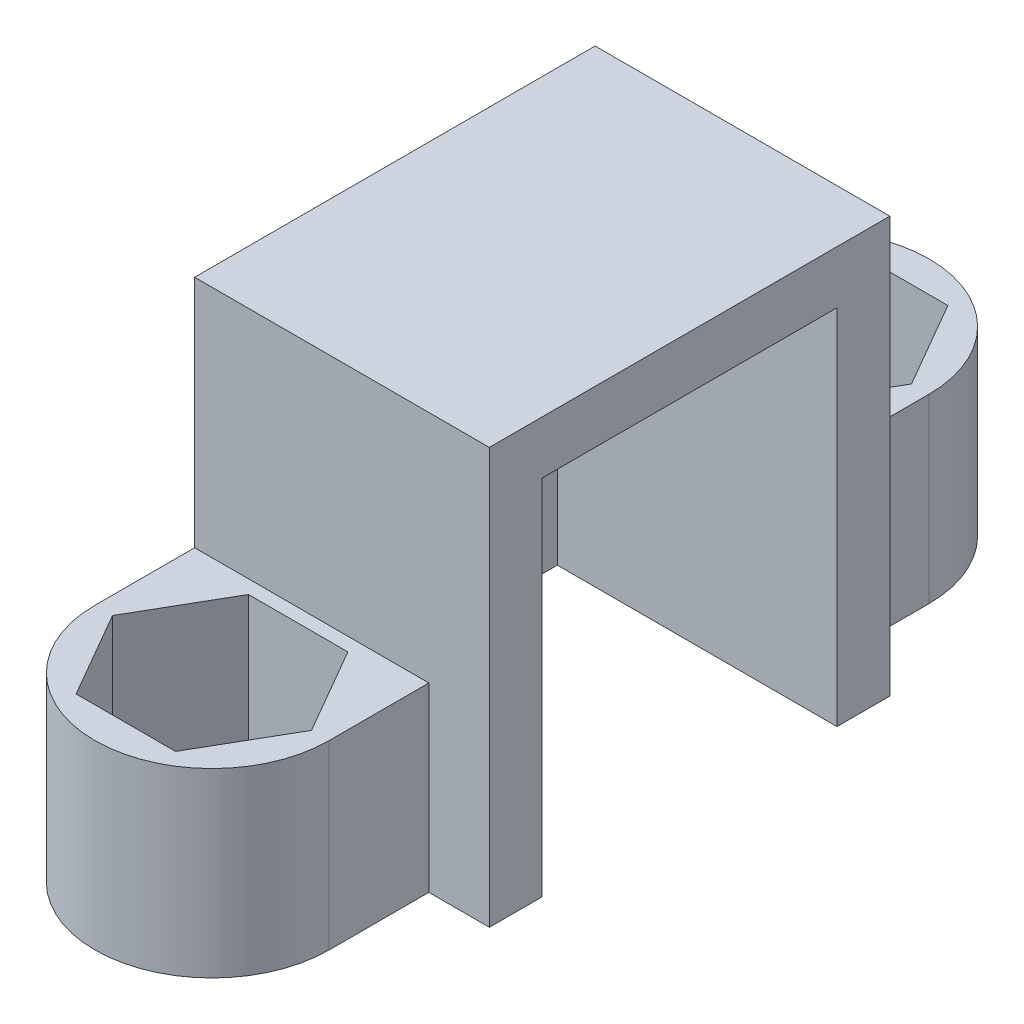
ISO-10303-21;
HEADER;
FILE_DESCRIPTION(('STEP AP214'),'2;1');
FILE_NAME('part.step','',(''),(''),'','','');
FILE_SCHEMA(('AUTOMOTIVE_DESIGN { 1 0 10303 214 1 1 1 1 }'));
ENDSEC;
DATA;
#1=APPLICATION_CONTEXT('core data for automotive mechanical design processes');
#2=APPLICATION_PROTOCOL_DEFINITION('international standard','automotive_design',2000,#1);
#3=PRODUCT_CONTEXT('',#1,'mechanical');
#4=PRODUCT('Part','Part','',(#3));
#5=PRODUCT_RELATED_PRODUCT_CATEGORY('part','',(#4));
#6=PRODUCT_DEFINITION_FORMATION('','',#4);
#7=PRODUCT_DEFINITION_CONTEXT('part definition',#1,'design');
#8=PRODUCT_DEFINITION('design','',#6,#7);
#9=PRODUCT_DEFINITION_SHAPE('','',#8);
#10=(LENGTH_UNIT() NAMED_UNIT(*) SI_UNIT(.MILLI.,.METRE.));
#11=(NAMED_UNIT(*) PLANE_ANGLE_UNIT() SI_UNIT($,.RADIAN.));
#12=(NAMED_UNIT(*) SI_UNIT($,.STERADIAN.) SOLID_ANGLE_UNIT());
#13=UNCERTAINTY_MEASURE_WITH_UNIT(LENGTH_MEASURE(1.E-05),#10,'distance_accuracy_value','');
#14=(GEOMETRIC_REPRESENTATION_CONTEXT(3) GLOBAL_UNCERTAINTY_ASSIGNED_CONTEXT((#13)) GLOBAL_UNIT_ASSIGNED_CONTEXT((#10,
#11,#12)) REPRESENTATION_CONTEXT('',''));
#15=CARTESIAN_POINT('',(0.,0.,0.));
#16=DIRECTION('',(0.,0.,1.));
#17=DIRECTION('',(1.,0.,0.));
#18=AXIS2_PLACEMENT_3D('',#15,#16,#17);
#19=CARTESIAN_POINT('',(9.75,5.125,0.));
#20=DIRECTION('',(0.,1.,0.));
#21=DIRECTION('',(0.,0.,1.));
#22=AXIS2_PLACEMENT_3D('',#19,#20,#21);
#23=PLANE('',#22);
#24=DIRECTION('',(0.,0.,1.));
#25=VECTOR('',#24,1.);
#26=CARTESIAN_POINT('',(0.5,5.125,0.));
#27=LINE('',#26,#25);
#28=CARTESIAN_POINT('',(0.5,5.125,-4.875));
#29=VERTEX_POINT('',#28);
#30=CARTESIAN_POINT('',(0.5,5.125,4.875));
#31=VERTEX_POINT('',#30);
#32=EDGE_CURVE('E295',#29,#31,#27,.T.);
#33=ORIENTED_EDGE('',*,*,#32,.F.);
#34=DIRECTION('',(-1.,0.,0.));
#35=VECTOR('',#34,1.);
#36=CARTESIAN_POINT('',(9.75,5.125,-4.875));
#37=LINE('',#36,#35);
#38=CARTESIAN_POINT('',(9.75,5.125,-4.875));
#39=VERTEX_POINT('',#38);
#40=EDGE_CURVE('E49',#39,#29,#37,.T.);
#41=ORIENTED_EDGE('',*,*,#40,.F.);
#42=DIRECTION('',(0.,0.,-1.));
#43=VECTOR('',#42,1.);
#44=CARTESIAN_POINT('',(9.75,5.125,0.));
#45=LINE('',#44,#43);
#46=CARTESIAN_POINT('',(9.75,5.125,4.875));
#47=VERTEX_POINT('',#46);
#48=EDGE_CURVE('E519',#47,#39,#45,.T.);
#49=ORIENTED_EDGE('',*,*,#48,.F.);
#50=DIRECTION('',(-1.,0.,0.));
#51=VECTOR('',#50,1.);
#52=CARTESIAN_POINT('',(9.75,5.125,4.875));
#53=LINE('',#52,#51);
#54=EDGE_CURVE('E546',#47,#31,#53,.T.);
#55=ORIENTED_EDGE('',*,*,#54,.T.);
#56=EDGE_LOOP('',(#33,#41,#49,#55));
#57=FACE_BOUND('',#56,.T.);
#58=ADVANCED_FACE('F41',(#57),#23,.F.);
#59=CARTESIAN_POINT('',(9.75,0.,-4.875));
#60=DIRECTION('',(0.,0.,-1.));
#61=DIRECTION('',(0.,1.,0.));
#62=AXIS2_PLACEMENT_3D('',#59,#60,#61);
#63=PLANE('',#62);
#64=DIRECTION('',(0.,1.,0.));
#65=VECTOR('',#64,1.);
#66=CARTESIAN_POINT('',(0.5,0.,-4.875));
#67=LINE('',#66,#65);
#68=CARTESIAN_POINT('',(0.5,-6.875,-4.875));
#69=VERTEX_POINT('',#68);
#70=EDGE_CURVE('E303',#69,#29,#67,.T.);
#71=ORIENTED_EDGE('',*,*,#70,.F.);
#72=DIRECTION('',(-1.,0.,0.));
#73=VECTOR('',#72,1.);
#74=CARTESIAN_POINT('',(9.75,-6.875,-4.875));
#75=LINE('',#74,#73);
#76=CARTESIAN_POINT('',(9.75,-6.875,-4.875));
#77=VERTEX_POINT('',#76);
#78=EDGE_CURVE('E248',#77,#69,#75,.T.);
#79=ORIENTED_EDGE('',*,*,#78,.F.);
#80=DIRECTION('',(0.,-1.,0.));
#81=VECTOR('',#80,1.);
#82=CARTESIAN_POINT('',(9.75,0.,-4.875));
#83=LINE('',#82,#81);
#84=EDGE_CURVE('E523',#39,#77,#83,.T.);
#85=ORIENTED_EDGE('',*,*,#84,.F.);
#86=ORIENTED_EDGE('',*,*,#40,.T.);
#87=EDGE_LOOP('',(#71,#79,#85,#86));
#88=FACE_BOUND('',#87,.T.);
#89=ADVANCED_FACE('F586',(#88),#63,.F.);
#90=CARTESIAN_POINT('',(9.75,0.,4.875));
#91=DIRECTION('',(0.,0.,-1.));
#92=DIRECTION('',(0.,1.,0.));
#93=AXIS2_PLACEMENT_3D('',#90,#91,#92);
#94=PLANE('',#93);
#95=DIRECTION('',(-1.,0.,0.));
#96=VECTOR('',#95,1.);
#97=CARTESIAN_POINT('',(9.75,-6.875,4.875));
#98=LINE('',#97,#96);
#99=CARTESIAN_POINT('',(9.75,-6.875,4.875));
#100=VERTEX_POINT('',#99);
#101=CARTESIAN_POINT('',(0.5,-6.875,4.875));
#102=VERTEX_POINT('',#101);
#103=EDGE_CURVE('E564',#100,#102,#98,.T.);
#104=ORIENTED_EDGE('',*,*,#103,.T.);
#105=DIRECTION('',(0.,1.,0.));
#106=VECTOR('',#105,1.);
#107=CARTESIAN_POINT('',(0.5,0.,4.875));
#108=LINE('',#107,#106);
#109=EDGE_CURVE('E11',#102,#31,#108,.T.);
#110=ORIENTED_EDGE('',*,*,#109,.T.);
#111=ORIENTED_EDGE('',*,*,#54,.F.);
#112=DIRECTION('',(0.,-1.,0.));
#113=VECTOR('',#112,1.);
#114=CARTESIAN_POINT('',(9.75,0.,4.875));
#115=LINE('',#114,#113);
#116=EDGE_CURVE('E542',#47,#100,#115,.T.);
#117=ORIENTED_EDGE('',*,*,#116,.T.);
#118=EDGE_LOOP('',(#104,#110,#111,#117));
#119=FACE_BOUND('',#118,.T.);
#120=ADVANCED_FACE('F593',(#119),#94,.T.);
#121=CARTESIAN_POINT('',(9.75,0.,6.625));
#122=DIRECTION('',(0.,0.,-1.));
#123=DIRECTION('',(0.,1.,0.));
#124=AXIS2_PLACEMENT_3D('',#121,#122,#123);
#125=PLANE('',#124);
#126=DIRECTION('',(0.,-1.,0.));
#127=VECTOR('',#126,1.);
#128=CARTESIAN_POINT('',(0.,0.,6.625));
#129=LINE('',#128,#127);
#130=CARTESIAN_POINT('',(0.,6.875,6.625));
#131=VERTEX_POINT('',#130);
#132=CARTESIAN_POINT('',(0.,-0.875,6.625));
#133=VERTEX_POINT('',#132);
#134=EDGE_CURVE('E557',#131,#133,#129,.T.);
#135=ORIENTED_EDGE('',*,*,#134,.T.);
#136=DIRECTION('',(-1.,0.,0.));
#137=VECTOR('',#136,1.);
#138=CARTESIAN_POINT('',(0.,-0.875,6.625));
#139=LINE('',#138,#137);
#140=CARTESIAN_POINT('',(7.75,-0.875,6.625));
#141=VERTEX_POINT('',#140);
#142=EDGE_CURVE('E459',#141,#133,#139,.T.);
#143=ORIENTED_EDGE('',*,*,#142,.F.);
#144=DIRECTION('',(0.,-1.,0.));
#145=VECTOR('',#144,1.);
#146=CARTESIAN_POINT('',(7.75,-0.875,6.625));
#147=LINE('',#146,#145);
#148=CARTESIAN_POINT('',(7.75,-6.875,6.625));
#149=VERTEX_POINT('',#148);
#150=EDGE_CURVE('E485',#141,#149,#147,.T.);
#151=ORIENTED_EDGE('',*,*,#150,.T.);
#152=DIRECTION('',(-1.,0.,0.));
#153=VECTOR('',#152,1.);
#154=CARTESIAN_POINT('',(9.75,-6.875,6.625));
#155=LINE('',#154,#153);
#156=CARTESIAN_POINT('',(9.75,-6.875,6.625));
#157=VERTEX_POINT('',#156);
#158=EDGE_CURVE('E568',#157,#149,#155,.T.);
#159=ORIENTED_EDGE('',*,*,#158,.F.);
#160=DIRECTION('',(0.,-1.,0.));
#161=VECTOR('',#160,1.);
#162=CARTESIAN_POINT('',(9.75,0.,6.625));
#163=LINE('',#162,#161);
#164=CARTESIAN_POINT('',(9.75,6.875,6.625));
#165=VERTEX_POINT('',#164);
#166=EDGE_CURVE('E539',#165,#157,#163,.T.);
#167=ORIENTED_EDGE('',*,*,#166,.F.);
#168=DIRECTION('',(-1.,0.,0.));
#169=VECTOR('',#168,1.);
#170=CARTESIAN_POINT('',(9.75,6.875,6.625));
#171=LINE('',#170,#169);
#172=EDGE_CURVE('E572',#165,#131,#171,.T.);
#173=ORIENTED_EDGE('',*,*,#172,.T.);
#174=EDGE_LOOP('',(#135,#143,#151,#159,#167,#173));
#175=FACE_BOUND('',#174,.T.);
#176=ADVANCED_FACE('F639',(#175),#125,.F.);
#177=CARTESIAN_POINT('',(9.75,-6.875,0.));
#178=DIRECTION('',(0.,1.,0.));
#179=DIRECTION('',(0.,0.,1.));
#180=AXIS2_PLACEMENT_3D('',#177,#178,#179);
#181=PLANE('',#180);
#182=DIRECTION('',(0.,0.,-1.));
#183=VECTOR('',#182,1.);
#184=CARTESIAN_POINT('',(0.,-6.875,0.));
#185=LINE('',#184,#183);
#186=CARTESIAN_POINT('',(0.,-6.875,-4.375));
#187=VERTEX_POINT('',#186);
#188=CARTESIAN_POINT('',(0.,-6.875,-9.925));
#189=VERTEX_POINT('',#188);
#190=EDGE_CURVE('E488',#187,#189,#185,.T.);
#191=ORIENTED_EDGE('',*,*,#190,.T.);
#192=CARTESIAN_POINT('',(3.875,-6.875,-9.925));
#193=DIRECTION('',(0.,1.,0.));
#194=DIRECTION('',(0.,0.,1.));
#195=AXIS2_PLACEMENT_3D('',#192,#193,#194);
#196=CIRCLE('',#195,3.875);
#197=CARTESIAN_POINT('',(7.75,-6.875,-9.925));
#198=VERTEX_POINT('',#197);
#199=EDGE_CURVE('E312',#189,#198,#196,.F.);
#200=ORIENTED_EDGE('',*,*,#199,.T.);
#201=DIRECTION('',(0.,0.,1.));
#202=VECTOR('',#201,1.);
#203=CARTESIAN_POINT('',(7.75,-6.875,-6.625));
#204=LINE('',#203,#202);
#205=CARTESIAN_POINT('',(7.75,-6.875,-6.625));
#206=VERTEX_POINT('',#205);
#207=EDGE_CURVE('E307',#198,#206,#204,.T.);
#208=ORIENTED_EDGE('',*,*,#207,.T.);
#209=DIRECTION('',(-1.,0.,0.));
#210=VECTOR('',#209,1.);
#211=CARTESIAN_POINT('',(9.75,-6.875,-6.625));
#212=LINE('',#211,#210);
#213=CARTESIAN_POINT('',(9.75,-6.875,-6.625));
#214=VERTEX_POINT('',#213);
#215=EDGE_CURVE('E578',#214,#206,#212,.T.);
#216=ORIENTED_EDGE('',*,*,#215,.F.);
#217=DIRECTION('',(0.,0.,-1.));
#218=VECTOR('',#217,1.);
#219=CARTESIAN_POINT('',(9.75,-6.875,0.));
#220=LINE('',#219,#218);
#221=EDGE_CURVE('E527',#77,#214,#220,.T.);
#222=ORIENTED_EDGE('',*,*,#221,.F.);
#223=ORIENTED_EDGE('',*,*,#78,.T.);
#224=DIRECTION('',(0.,0.,1.));
#225=VECTOR('',#224,1.);
#226=CARTESIAN_POINT('',(0.5,-6.875,-6.625));
#227=LINE('',#226,#225);
#228=CARTESIAN_POINT('',(0.5,-6.875,-4.375));
#229=VERTEX_POINT('',#228);
#230=EDGE_CURVE('E240',#69,#229,#227,.T.);
#231=ORIENTED_EDGE('',*,*,#230,.T.);
#232=DIRECTION('',(-1.,0.,0.));
#233=VECTOR('',#232,1.);
#234=CARTESIAN_POINT('',(0.5,-6.875,-4.375));
#235=LINE('',#234,#233);
#236=EDGE_CURVE('E244',#229,#187,#235,.T.);
#237=ORIENTED_EDGE('',*,*,#236,.T.);
#238=EDGE_LOOP('',(#191,#200,#208,#216,#222,#223,#231,#237));
#239=FACE_BOUND('',#238,.T.);
#240=CARTESIAN_POINT('',(3.875,-6.875,-9.925));
#241=DIRECTION('',(0.,1.,0.));
#242=DIRECTION('',(0.,0.,1.));
#243=AXIS2_PLACEMENT_3D('',#240,#241,#242);
#244=CIRCLE('',#243,1.6);
#245=CARTESIAN_POINT('',(3.875,-6.875,-8.325));
#246=VERTEX_POINT('',#245);
#247=EDGE_CURVE('E311',#246,#246,#244,.F.);
#248=ORIENTED_EDGE('',*,*,#247,.F.);
#249=EDGE_LOOP('',(#248));
#250=FACE_BOUND('',#249,.T.);
#251=ADVANCED_FACE('F242',(#239,#250),#181,.F.);
#252=CARTESIAN_POINT('',(9.75,0.,-6.625));
#253=DIRECTION('',(0.,0.,-1.));
#254=DIRECTION('',(0.,1.,0.));
#255=AXIS2_PLACEMENT_3D('',#252,#253,#254);
#256=PLANE('',#255);
#257=DIRECTION('',(0.,-1.,0.));
#258=VECTOR('',#257,1.);
#259=CARTESIAN_POINT('',(0.,0.,-6.625));
#260=LINE('',#259,#258);
#261=CARTESIAN_POINT('',(0.,6.875,-6.625));
#262=VERTEX_POINT('',#261);
#263=CARTESIAN_POINT('',(0.,-0.875,-6.625));
#264=VERTEX_POINT('',#263);
#265=EDGE_CURVE('E549',#262,#264,#260,.T.);
#266=ORIENTED_EDGE('',*,*,#265,.F.);
#267=DIRECTION('',(-1.,0.,0.));
#268=VECTOR('',#267,1.);
#269=CARTESIAN_POINT('',(9.75,6.875,-6.625));
#270=LINE('',#269,#268);
#271=CARTESIAN_POINT('',(9.75,6.875,-6.625));
#272=VERTEX_POINT('',#271);
#273=EDGE_CURVE('E575',#272,#262,#270,.T.);
#274=ORIENTED_EDGE('',*,*,#273,.F.);
#275=DIRECTION('',(0.,-1.,0.));
#276=VECTOR('',#275,1.);
#277=CARTESIAN_POINT('',(9.75,0.,-6.625));
#278=LINE('',#277,#276);
#279=EDGE_CURVE('E530',#272,#214,#278,.T.);
#280=ORIENTED_EDGE('',*,*,#279,.T.);
#281=ORIENTED_EDGE('',*,*,#215,.T.);
#282=DIRECTION('',(0.,-1.,0.));
#283=VECTOR('',#282,1.);
#284=CARTESIAN_POINT('',(7.75,-0.875,-6.625));
#285=LINE('',#284,#283);
#286=CARTESIAN_POINT('',(7.75,-0.875,-6.625));
#287=VERTEX_POINT('',#286);
#288=EDGE_CURVE('E56',#287,#206,#285,.T.);
#289=ORIENTED_EDGE('',*,*,#288,.F.);
#290=DIRECTION('',(-1.,0.,0.));
#291=VECTOR('',#290,1.);
#292=CARTESIAN_POINT('',(0.,-0.875,-6.625));
#293=LINE('',#292,#291);
#294=EDGE_CURVE('E63',#287,#264,#293,.T.);
#295=ORIENTED_EDGE('',*,*,#294,.T.);
#296=EDGE_LOOP('',(#266,#274,#280,#281,#289,#295));
#297=FACE_BOUND('',#296,.T.);
#298=ADVANCED_FACE('F616',(#297),#256,.T.);
#299=CARTESIAN_POINT('',(9.75,6.875,0.));
#300=DIRECTION('',(0.,1.,0.));
#301=DIRECTION('',(0.,0.,1.));
#302=AXIS2_PLACEMENT_3D('',#299,#300,#301);
#303=PLANE('',#302);
#304=DIRECTION('',(0.,0.,-1.));
#305=VECTOR('',#304,1.);
#306=CARTESIAN_POINT('',(0.,6.875,0.));
#307=LINE('',#306,#305);
#308=EDGE_CURVE('E553',#131,#262,#307,.T.);
#309=ORIENTED_EDGE('',*,*,#308,.F.);
#310=ORIENTED_EDGE('',*,*,#172,.F.);
#311=DIRECTION('',(0.,0.,-1.));
#312=VECTOR('',#311,1.);
#313=CARTESIAN_POINT('',(9.75,6.875,0.));
#314=LINE('',#313,#312);
#315=EDGE_CURVE('E535',#165,#272,#314,.T.);
#316=ORIENTED_EDGE('',*,*,#315,.T.);
#317=ORIENTED_EDGE('',*,*,#273,.T.);
#318=EDGE_LOOP('',(#309,#310,#316,#317));
#319=FACE_BOUND('',#318,.T.);
#320=ADVANCED_FACE('F643',(#319),#303,.T.);
#321=CARTESIAN_POINT('',(0.,-6.875,9.925));
#322=VERTEX_POINT('',#321);
#323=CARTESIAN_POINT('',(0.,-6.875,4.375));
#324=VERTEX_POINT('',#323);
#325=EDGE_CURVE('E524',#322,#324,#185,.T.);
#326=ORIENTED_EDGE('',*,*,#325,.T.);
#327=DIRECTION('',(-1.,0.,0.));
#328=VECTOR('',#327,1.);
#329=CARTESIAN_POINT('',(0.5,-6.875,4.375));
#330=LINE('',#329,#328);
#331=CARTESIAN_POINT('',(0.5,-6.875,4.375));
#332=VERTEX_POINT('',#331);
#333=EDGE_CURVE('E291',#332,#324,#330,.T.);
#334=ORIENTED_EDGE('',*,*,#333,.F.);
#335=DIRECTION('',(0.,0.,1.));
#336=VECTOR('',#335,1.);
#337=CARTESIAN_POINT('',(0.5,-6.875,4.375));
#338=LINE('',#337,#336);
#339=EDGE_CURVE('E263',#332,#102,#338,.T.);
#340=ORIENTED_EDGE('',*,*,#339,.T.);
#341=ORIENTED_EDGE('',*,*,#103,.F.);
#342=EDGE_CURVE('E531',#157,#100,#220,.T.);
#343=ORIENTED_EDGE('',*,*,#342,.F.);
#344=ORIENTED_EDGE('',*,*,#158,.T.);
#345=DIRECTION('',(0.,0.,-1.));
#346=VECTOR('',#345,1.);
#347=CARTESIAN_POINT('',(7.75,-6.875,6.625));
#348=LINE('',#347,#346);
#349=CARTESIAN_POINT('',(7.75,-6.875,9.925));
#350=VERTEX_POINT('',#349);
#351=EDGE_CURVE('E415',#350,#149,#348,.T.);
#352=ORIENTED_EDGE('',*,*,#351,.F.);
#353=CARTESIAN_POINT('',(3.875,-6.875,9.925));
#354=DIRECTION('',(0.,1.,0.));
#355=DIRECTION('',(0.,0.,1.));
#356=AXIS2_PLACEMENT_3D('',#353,#354,#355);
#357=CIRCLE('',#356,3.875);
#358=EDGE_CURVE('E419',#322,#350,#357,.T.);
#359=ORIENTED_EDGE('',*,*,#358,.F.);
#360=EDGE_LOOP('',(#326,#334,#340,#341,#343,#344,#352,#359));
#361=FACE_BOUND('',#360,.T.);
#362=CARTESIAN_POINT('',(3.875,-6.875,9.925));
#363=DIRECTION('',(0.,1.,0.));
#364=DIRECTION('',(0.,0.,1.));
#365=AXIS2_PLACEMENT_3D('',#362,#363,#364);
#366=CIRCLE('',#365,1.6);
#367=CARTESIAN_POINT('',(3.875,-6.875,11.525));
#368=VERTEX_POINT('',#367);
#369=EDGE_CURVE('E423',#368,#368,#366,.T.);
#370=ORIENTED_EDGE('',*,*,#369,.T.);
#371=EDGE_LOOP('',(#370));
#372=FACE_BOUND('',#371,.T.);
#373=ADVANCED_FACE('F597',(#361,#372),#181,.F.);
#374=CARTESIAN_POINT('',(9.75,0.,0.));
#375=DIRECTION('',(1.,0.,0.));
#376=DIRECTION('',(0.,0.,-1.));
#377=AXIS2_PLACEMENT_3D('',#374,#375,#376);
#378=PLANE('',#377);
#379=ORIENTED_EDGE('',*,*,#48,.T.);
#380=ORIENTED_EDGE('',*,*,#84,.T.);
#381=ORIENTED_EDGE('',*,*,#221,.T.);
#382=ORIENTED_EDGE('',*,*,#279,.F.);
#383=ORIENTED_EDGE('',*,*,#315,.F.);
#384=ORIENTED_EDGE('',*,*,#166,.T.);
#385=ORIENTED_EDGE('',*,*,#342,.T.);
#386=ORIENTED_EDGE('',*,*,#116,.F.);
#387=EDGE_LOOP('',(#379,#380,#381,#382,#383,#384,#385,#386));
#388=FACE_BOUND('',#387,.T.);
#389=ADVANCED_FACE('F619',(#388),#378,.T.);
#390=CARTESIAN_POINT('',(0.,0.,0.));
#391=DIRECTION('',(1.,0.,0.));
#392=DIRECTION('',(0.,0.,-1.));
#393=AXIS2_PLACEMENT_3D('',#390,#391,#392);
#394=PLANE('',#393);
#395=ORIENTED_EDGE('',*,*,#190,.F.);
#396=DIRECTION('',(0.,1.,0.));
#397=VECTOR('',#396,1.);
#398=CARTESIAN_POINT('',(0.,-6.875,-4.375));
#399=LINE('',#398,#397);
#400=CARTESIAN_POINT('',(0.,4.625,-4.375));
#401=VERTEX_POINT('',#400);
#402=EDGE_CURVE('E260',#187,#401,#399,.T.);
#403=ORIENTED_EDGE('',*,*,#402,.T.);
#404=DIRECTION('',(0.,0.,1.));
#405=VECTOR('',#404,1.);
#406=CARTESIAN_POINT('',(0.,4.625,-4.375));
#407=LINE('',#406,#405);
#408=CARTESIAN_POINT('',(0.,4.625,4.375));
#409=VERTEX_POINT('',#408);
#410=EDGE_CURVE('E284',#401,#409,#407,.T.);
#411=ORIENTED_EDGE('',*,*,#410,.T.);
#412=DIRECTION('',(0.,-1.,0.));
#413=VECTOR('',#412,1.);
#414=CARTESIAN_POINT('',(0.,4.625,4.375));
#415=LINE('',#414,#413);
#416=EDGE_CURVE('E254',#409,#324,#415,.T.);
#417=ORIENTED_EDGE('',*,*,#416,.T.);
#418=ORIENTED_EDGE('',*,*,#325,.F.);
#419=DIRECTION('',(0.,-1.,0.));
#420=VECTOR('',#419,1.);
#421=CARTESIAN_POINT('',(0.,-0.875,9.925));
#422=LINE('',#421,#420);
#423=CARTESIAN_POINT('',(0.,-0.875,9.925));
#424=VERTEX_POINT('',#423);
#425=EDGE_CURVE('E489',#424,#322,#422,.T.);
#426=ORIENTED_EDGE('',*,*,#425,.F.);
#427=DIRECTION('',(0.,0.,1.));
#428=VECTOR('',#427,1.);
#429=CARTESIAN_POINT('',(0.,-0.875,0.));
#430=LINE('',#429,#428);
#431=EDGE_CURVE('E456',#133,#424,#430,.T.);
#432=ORIENTED_EDGE('',*,*,#431,.F.);
#433=ORIENTED_EDGE('',*,*,#134,.F.);
#434=ORIENTED_EDGE('',*,*,#308,.T.);
#435=ORIENTED_EDGE('',*,*,#265,.T.);
#436=DIRECTION('',(0.,0.,-1.));
#437=VECTOR('',#436,1.);
#438=CARTESIAN_POINT('',(0.,-0.875,0.));
#439=LINE('',#438,#437);
#440=CARTESIAN_POINT('',(0.,-0.875,-9.925));
#441=VERTEX_POINT('',#440);
#442=EDGE_CURVE('E354',#264,#441,#439,.T.);
#443=ORIENTED_EDGE('',*,*,#442,.T.);
#444=DIRECTION('',(0.,-1.,0.));
#445=VECTOR('',#444,1.);
#446=CARTESIAN_POINT('',(0.,-0.875,-9.925));
#447=LINE('',#446,#445);
#448=EDGE_CURVE('E388',#441,#189,#447,.T.);
#449=ORIENTED_EDGE('',*,*,#448,.T.);
#450=EDGE_LOOP('',(#395,#403,#411,#417,#418,#426,#432,#433,#434,#435,#443,#449));
#451=FACE_BOUND('',#450,.T.);
#452=ADVANCED_FACE('F606',(#451),#394,.F.);
#453=CARTESIAN_POINT('',(7.75,-0.875,0.));
#454=DIRECTION('',(1.,0.,0.));
#455=DIRECTION('',(0.,0.,-1.));
#456=AXIS2_PLACEMENT_3D('',#453,#454,#455);
#457=PLANE('',#456);
#458=DIRECTION('',(0.,-1.,0.));
#459=VECTOR('',#458,1.);
#460=CARTESIAN_POINT('',(7.75,-0.875,9.925));
#461=LINE('',#460,#459);
#462=CARTESIAN_POINT('',(7.75,-0.875,9.925));
#463=VERTEX_POINT('',#462);
#464=EDGE_CURVE('E493',#463,#350,#461,.T.);
#465=ORIENTED_EDGE('',*,*,#464,.T.);
#466=ORIENTED_EDGE('',*,*,#351,.T.);
#467=ORIENTED_EDGE('',*,*,#150,.F.);
#468=DIRECTION('',(0.,0.,1.));
#469=VECTOR('',#468,1.);
#470=CARTESIAN_POINT('',(7.75,-0.875,0.));
#471=LINE('',#470,#469);
#472=EDGE_CURVE('E448',#141,#463,#471,.T.);
#473=ORIENTED_EDGE('',*,*,#472,.T.);
#474=EDGE_LOOP('',(#465,#466,#467,#473));
#475=FACE_BOUND('',#474,.T.);
#476=ADVANCED_FACE('F637',(#475),#457,.T.);
#477=CARTESIAN_POINT('',(0.,-0.875,12.775));
#478=DIRECTION('',(0.,0.,1.));
#479=DIRECTION('',(1.,0.,0.));
#480=AXIS2_PLACEMENT_3D('',#477,#478,#479);
#481=PLANE('',#480);
#482=DIRECTION('',(-1.,0.,0.));
#483=VECTOR('',#482,1.);
#484=CARTESIAN_POINT('',(0.,-5.875,12.775));
#485=LINE('',#484,#483);
#486=CARTESIAN_POINT('',(5.52044826719043,-5.875,12.775));
#487=VERTEX_POINT('',#486);
#488=CARTESIAN_POINT('',(2.22955173280956,-5.875,12.775));
#489=VERTEX_POINT('',#488);
#490=EDGE_CURVE('E427',#487,#489,#485,.T.);
#491=ORIENTED_EDGE('',*,*,#490,.T.);
#492=DIRECTION('',(0.,-1.,0.));
#493=VECTOR('',#492,1.);
#494=CARTESIAN_POINT('',(2.22955173280956,-0.875,12.775));
#495=LINE('',#494,#493);
#496=CARTESIAN_POINT('',(2.22955173280956,-0.875,12.775));
#497=VERTEX_POINT('',#496);
#498=EDGE_CURVE('E496',#497,#489,#495,.T.);
#499=ORIENTED_EDGE('',*,*,#498,.F.);
#500=DIRECTION('',(-1.,0.,0.));
#501=VECTOR('',#500,1.);
#502=CARTESIAN_POINT('',(0.,-0.875,12.775));
#503=LINE('',#502,#501);
#504=CARTESIAN_POINT('',(5.52044826719043,-0.875,12.775));
#505=VERTEX_POINT('',#504);
#506=EDGE_CURVE('E428',#505,#497,#503,.T.);
#507=ORIENTED_EDGE('',*,*,#506,.F.);
#508=DIRECTION('',(0.,-1.,0.));
#509=VECTOR('',#508,1.);
#510=CARTESIAN_POINT('',(5.52044826719043,-0.875,12.775));
#511=LINE('',#510,#509);
#512=EDGE_CURVE('E462',#505,#487,#511,.T.);
#513=ORIENTED_EDGE('',*,*,#512,.T.);
#514=EDGE_LOOP('',(#491,#499,#507,#513));
#515=FACE_BOUND('',#514,.T.);
#516=ADVANCED_FACE('F669',(#515),#481,.F.);
#517=CARTESIAN_POINT('',(-3.85957346706593,-0.875,2.22832578016765));
#518=DIRECTION('',(-0.866025403784439,0.,0.5));
#519=DIRECTION('',(0.5,0.,0.866025403784439));
#520=AXIS2_PLACEMENT_3D('',#517,#518,#519);
#521=PLANE('',#520);
#522=DIRECTION('',(-0.5,0.,-0.866025403784439));
#523=VECTOR('',#522,1.);
#524=CARTESIAN_POINT('',(-3.85957346706593,-5.875,2.22832578016765));
#525=LINE('',#524,#523);
#526=CARTESIAN_POINT('',(0.584103465619132,-5.875,9.925));
#527=VERTEX_POINT('',#526);
#528=EDGE_CURVE('E433',#489,#527,#525,.T.);
#529=ORIENTED_EDGE('',*,*,#528,.T.);
#530=DIRECTION('',(0.,-1.,0.));
#531=VECTOR('',#530,1.);
#532=CARTESIAN_POINT('',(0.584103465619132,-0.875,9.925));
#533=LINE('',#532,#531);
#534=CARTESIAN_POINT('',(0.584103465619132,-0.875,9.925));
#535=VERTEX_POINT('',#534);
#536=EDGE_CURVE('E500',#535,#527,#533,.T.);
#537=ORIENTED_EDGE('',*,*,#536,.F.);
#538=DIRECTION('',(-0.5,0.,-0.866025403784439));
#539=VECTOR('',#538,1.);
#540=CARTESIAN_POINT('',(-3.85957346706593,-0.875,2.22832578016765));
#541=LINE('',#540,#539);
#542=EDGE_CURVE('E445',#497,#535,#541,.T.);
#543=ORIENTED_EDGE('',*,*,#542,.F.);
#544=ORIENTED_EDGE('',*,*,#498,.T.);
#545=EDGE_LOOP('',(#529,#537,#543,#544));
#546=FACE_BOUND('',#545,.T.);
#547=ADVANCED_FACE('F672',(#546),#521,.F.);
#548=CARTESIAN_POINT('',(4.73572866549463,-0.875,2.73417421983235));
#549=DIRECTION('',(-0.866025403784438,0.,-0.5));
#550=DIRECTION('',(-0.5,0.,0.866025403784439));
#551=AXIS2_PLACEMENT_3D('',#548,#549,#550);
#552=PLANE('',#551);
#553=DIRECTION('',(0.5,0.,-0.866025403784439));
#554=VECTOR('',#553,1.);
#555=CARTESIAN_POINT('',(4.73572866549463,-5.875,2.73417421983235));
#556=LINE('',#555,#554);
#557=CARTESIAN_POINT('',(2.22955173280957,-5.875,7.075));
#558=VERTEX_POINT('',#557);
#559=EDGE_CURVE('E478',#527,#558,#556,.T.);
#560=ORIENTED_EDGE('',*,*,#559,.T.);
#561=DIRECTION('',(0.,-1.,0.));
#562=VECTOR('',#561,1.);
#563=CARTESIAN_POINT('',(2.22955173280957,-0.875,7.075));
#564=LINE('',#563,#562);
#565=CARTESIAN_POINT('',(2.22955173280957,-0.875,7.075));
#566=VERTEX_POINT('',#565);
#567=EDGE_CURVE('E504',#566,#558,#564,.T.);
#568=ORIENTED_EDGE('',*,*,#567,.F.);
#569=DIRECTION('',(0.5,0.,-0.866025403784439));
#570=VECTOR('',#569,1.);
#571=CARTESIAN_POINT('',(4.73572866549463,-0.875,2.73417421983235));
#572=LINE('',#571,#570);
#573=EDGE_CURVE('E442',#535,#566,#572,.T.);
#574=ORIENTED_EDGE('',*,*,#573,.F.);
#575=ORIENTED_EDGE('',*,*,#536,.T.);
#576=EDGE_LOOP('',(#560,#568,#574,#575));
#577=FACE_BOUND('',#576,.T.);
#578=ADVANCED_FACE('F685',(#577),#552,.F.);
#579=CARTESIAN_POINT('',(0.,-0.875,7.075));
#580=DIRECTION('',(0.,0.,-1.));
#581=DIRECTION('',(-1.,0.,0.));
#582=AXIS2_PLACEMENT_3D('',#579,#580,#581);
#583=PLANE('',#582);
#584=DIRECTION('',(1.,0.,0.));
#585=VECTOR('',#584,1.);
#586=CARTESIAN_POINT('',(0.,-5.875,7.075));
#587=LINE('',#586,#585);
#588=CARTESIAN_POINT('',(5.52044826719043,-5.875,7.075));
#589=VERTEX_POINT('',#588);
#590=EDGE_CURVE('E474',#558,#589,#587,.T.);
#591=ORIENTED_EDGE('',*,*,#590,.T.);
#592=DIRECTION('',(0.,-1.,0.));
#593=VECTOR('',#592,1.);
#594=CARTESIAN_POINT('',(5.52044826719043,-0.875,7.075));
#595=LINE('',#594,#593);
#596=CARTESIAN_POINT('',(5.52044826719043,-0.875,7.075));
#597=VERTEX_POINT('',#596);
#598=EDGE_CURVE('E508',#597,#589,#595,.T.);
#599=ORIENTED_EDGE('',*,*,#598,.F.);
#600=DIRECTION('',(1.,0.,0.));
#601=VECTOR('',#600,1.);
#602=CARTESIAN_POINT('',(0.,-0.875,7.075));
#603=LINE('',#602,#601);
#604=EDGE_CURVE('E439',#566,#597,#603,.T.);
#605=ORIENTED_EDGE('',*,*,#604,.F.);
#606=ORIENTED_EDGE('',*,*,#567,.T.);
#607=EDGE_LOOP('',(#591,#599,#605,#606));
#608=FACE_BOUND('',#607,.T.);
#609=ADVANCED_FACE('F681',(#608),#583,.F.);
#610=CARTESIAN_POINT('',(1.07677133450538,-0.875,-0.62167421983235));
#611=DIRECTION('',(0.866025403784439,0.,-0.5));
#612=DIRECTION('',(-0.5,0.,-0.866025403784439));
#613=AXIS2_PLACEMENT_3D('',#610,#611,#612);
#614=PLANE('',#613);
#615=DIRECTION('',(0.5,0.,0.866025403784439));
#616=VECTOR('',#615,1.);
#617=CARTESIAN_POINT('',(1.07677133450538,-5.875,-0.62167421983235));
#618=LINE('',#617,#616);
#619=CARTESIAN_POINT('',(7.16589653438087,-5.875,9.925));
#620=VERTEX_POINT('',#619);
#621=EDGE_CURVE('E470',#589,#620,#618,.T.);
#622=ORIENTED_EDGE('',*,*,#621,.T.);
#623=DIRECTION('',(0.,-1.,0.));
#624=VECTOR('',#623,1.);
#625=CARTESIAN_POINT('',(7.16589653438086,-0.875,9.925));
#626=LINE('',#625,#624);
#627=CARTESIAN_POINT('',(7.16589653438086,-0.875,9.925));
#628=VERTEX_POINT('',#627);
#629=EDGE_CURVE('E512',#628,#620,#626,.T.);
#630=ORIENTED_EDGE('',*,*,#629,.F.);
#631=DIRECTION('',(0.5,0.,0.866025403784439));
#632=VECTOR('',#631,1.);
#633=CARTESIAN_POINT('',(1.07677133450538,-0.875,-0.62167421983235));
#634=LINE('',#633,#632);
#635=EDGE_CURVE('E436',#597,#628,#634,.T.);
#636=ORIENTED_EDGE('',*,*,#635,.F.);
#637=ORIENTED_EDGE('',*,*,#598,.T.);
#638=EDGE_LOOP('',(#622,#630,#636,#637));
#639=FACE_BOUND('',#638,.T.);
#640=ADVANCED_FACE('F677',(#639),#614,.F.);
#641=CARTESIAN_POINT('',(9.67207346706593,-0.875,5.58417421983235));
#642=DIRECTION('',(0.866025403784438,0.,0.5));
#643=DIRECTION('',(0.5,0.,-0.866025403784439));
#644=AXIS2_PLACEMENT_3D('',#641,#642,#643);
#645=PLANE('',#644);
#646=DIRECTION('',(-0.5,0.,0.866025403784439));
#647=VECTOR('',#646,1.);
#648=CARTESIAN_POINT('',(9.67207346706593,-5.875,5.58417421983235));
#649=LINE('',#648,#647);
#650=EDGE_CURVE('E466',#620,#487,#649,.T.);
#651=ORIENTED_EDGE('',*,*,#650,.T.);
#652=ORIENTED_EDGE('',*,*,#512,.F.);
#653=DIRECTION('',(-0.5,0.,0.866025403784439));
#654=VECTOR('',#653,1.);
#655=CARTESIAN_POINT('',(9.67207346706593,-0.875,5.58417421983235));
#656=LINE('',#655,#654);
#657=EDGE_CURVE('E432',#628,#505,#656,.T.);
#658=ORIENTED_EDGE('',*,*,#657,.F.);
#659=ORIENTED_EDGE('',*,*,#629,.T.);
#660=EDGE_LOOP('',(#651,#652,#658,#659));
#661=FACE_BOUND('',#660,.T.);
#662=ADVANCED_FACE('F674',(#661),#645,.F.);
#663=CARTESIAN_POINT('',(3.875,-0.875,9.925));
#664=DIRECTION('',(0.,-1.,0.));
#665=DIRECTION('',(0.,0.,-1.));
#666=AXIS2_PLACEMENT_3D('',#663,#664,#665);
#667=CYLINDRICAL_SURFACE('',#666,3.875);
#668=ORIENTED_EDGE('',*,*,#425,.T.);
#669=ORIENTED_EDGE('',*,*,#358,.T.);
#670=ORIENTED_EDGE('',*,*,#464,.F.);
#671=CARTESIAN_POINT('',(3.875,-0.875,9.925));
#672=DIRECTION('',(0.,-1.,0.));
#673=DIRECTION('',(0.,0.,-1.));
#674=AXIS2_PLACEMENT_3D('',#671,#672,#673);
#675=CIRCLE('',#674,3.875);
#676=EDGE_CURVE('E452',#463,#424,#675,.T.);
#677=ORIENTED_EDGE('',*,*,#676,.T.);
#678=EDGE_LOOP('',(#668,#669,#670,#677));
#679=FACE_BOUND('',#678,.T.);
#680=ADVANCED_FACE('F630',(#679),#667,.T.);
#681=CARTESIAN_POINT('',(0.,-0.875,0.));
#682=DIRECTION('',(0.,-1.,0.));
#683=DIRECTION('',(0.,0.,-1.));
#684=AXIS2_PLACEMENT_3D('',#681,#682,#683);
#685=PLANE('',#684);
#686=ORIENTED_EDGE('',*,*,#506,.T.);
#687=ORIENTED_EDGE('',*,*,#542,.T.);
#688=ORIENTED_EDGE('',*,*,#573,.T.);
#689=ORIENTED_EDGE('',*,*,#604,.T.);
#690=ORIENTED_EDGE('',*,*,#635,.T.);
#691=ORIENTED_EDGE('',*,*,#657,.T.);
#692=EDGE_LOOP('',(#686,#687,#688,#689,#690,#691));
#693=FACE_BOUND('',#692,.T.);
#694=ORIENTED_EDGE('',*,*,#472,.F.);
#695=ORIENTED_EDGE('',*,*,#142,.T.);
#696=ORIENTED_EDGE('',*,*,#431,.T.);
#697=ORIENTED_EDGE('',*,*,#676,.F.);
#698=EDGE_LOOP('',(#694,#695,#696,#697));
#699=FACE_BOUND('',#698,.T.);
#700=ADVANCED_FACE('F634',(#693,#699),#685,.F.);
#701=CARTESIAN_POINT('',(3.875,-5.875,9.925));
#702=DIRECTION('',(0.,-1.,0.));
#703=DIRECTION('',(0.,0.,-1.));
#704=AXIS2_PLACEMENT_3D('',#701,#702,#703);
#705=PLANE('',#704);
#706=CARTESIAN_POINT('',(3.875,-5.875,9.925));
#707=DIRECTION('',(0.,-1.,0.));
#708=DIRECTION('',(0.,0.,-1.));
#709=AXIS2_PLACEMENT_3D('',#706,#707,#708);
#710=CIRCLE('',#709,1.6);
#711=CARTESIAN_POINT('',(3.875,-5.875,8.325));
#712=VERTEX_POINT('',#711);
#713=EDGE_CURVE('E387',#712,#712,#710,.T.);
#714=ORIENTED_EDGE('',*,*,#713,.T.);
#715=EDGE_LOOP('',(#714));
#716=FACE_BOUND('',#715,.T.);
#717=ORIENTED_EDGE('',*,*,#528,.F.);
#718=ORIENTED_EDGE('',*,*,#490,.F.);
#719=ORIENTED_EDGE('',*,*,#650,.F.);
#720=ORIENTED_EDGE('',*,*,#621,.F.);
#721=ORIENTED_EDGE('',*,*,#590,.F.);
#722=ORIENTED_EDGE('',*,*,#559,.F.);
#723=EDGE_LOOP('',(#717,#718,#719,#720,#721,#722));
#724=FACE_BOUND('',#723,.T.);
#725=ADVANCED_FACE('F699',(#716,#724),#705,.F.);
#726=CARTESIAN_POINT('',(3.875,-17.4363978714941,9.925));
#727=DIRECTION('',(0.,1.,0.));
#728=DIRECTION('',(0.,0.,1.));
#729=AXIS2_PLACEMENT_3D('',#726,#727,#728);
#730=CYLINDRICAL_SURFACE('',#729,1.6);
#731=ORIENTED_EDGE('',*,*,#369,.F.);
#732=EDGE_LOOP('',(#731));
#733=FACE_BOUND('',#732,.T.);
#734=ORIENTED_EDGE('',*,*,#713,.F.);
#735=EDGE_LOOP('',(#734));
#736=FACE_BOUND('',#735,.T.);
#737=ADVANCED_FACE('F701',(#733,#736),#730,.F.);
#738=CARTESIAN_POINT('',(7.75,-0.875,0.));
#739=DIRECTION('',(-1.,0.,0.));
#740=DIRECTION('',(0.,0.,1.));
#741=AXIS2_PLACEMENT_3D('',#738,#739,#740);
#742=PLANE('',#741);
#743=ORIENTED_EDGE('',*,*,#288,.T.);
#744=ORIENTED_EDGE('',*,*,#207,.F.);
#745=DIRECTION('',(0.,-1.,0.));
#746=VECTOR('',#745,1.);
#747=CARTESIAN_POINT('',(7.75,-0.875,-9.925));
#748=LINE('',#747,#746);
#749=CARTESIAN_POINT('',(7.75,-0.875,-9.925));
#750=VERTEX_POINT('',#749);
#751=EDGE_CURVE('E384',#750,#198,#748,.T.);
#752=ORIENTED_EDGE('',*,*,#751,.F.);
#753=DIRECTION('',(0.,0.,-1.));
#754=VECTOR('',#753,1.);
#755=CARTESIAN_POINT('',(7.75,-0.875,0.));
#756=LINE('',#755,#754);
#757=EDGE_CURVE('E348',#287,#750,#756,.T.);
#758=ORIENTED_EDGE('',*,*,#757,.F.);
#759=EDGE_LOOP('',(#743,#744,#752,#758));
#760=FACE_BOUND('',#759,.T.);
#761=ADVANCED_FACE('F612',(#760),#742,.F.);
#762=CARTESIAN_POINT('',(3.875,-0.875,-9.925));
#763=DIRECTION('',(0.,-1.,0.));
#764=DIRECTION('',(0.,0.,-1.));
#765=AXIS2_PLACEMENT_3D('',#762,#763,#764);
#766=CYLINDRICAL_SURFACE('',#765,3.875);
#767=ORIENTED_EDGE('',*,*,#751,.T.);
#768=ORIENTED_EDGE('',*,*,#199,.F.);
#769=ORIENTED_EDGE('',*,*,#448,.F.);
#770=CARTESIAN_POINT('',(3.875,-0.875,-9.925));
#771=DIRECTION('',(0.,1.,0.));
#772=DIRECTION('',(0.,0.,1.));
#773=AXIS2_PLACEMENT_3D('',#770,#771,#772);
#774=CIRCLE('',#773,3.875);
#775=EDGE_CURVE('E358',#750,#441,#774,.T.);
#776=ORIENTED_EDGE('',*,*,#775,.F.);
#777=EDGE_LOOP('',(#767,#768,#769,#776));
#778=FACE_BOUND('',#777,.T.);
#779=ADVANCED_FACE('F613',(#778),#766,.T.);
#780=CARTESIAN_POINT('',(0.,-0.875,-12.775));
#781=DIRECTION('',(0.,0.,1.));
#782=DIRECTION('',(1.,0.,0.));
#783=AXIS2_PLACEMENT_3D('',#780,#781,#782);
#784=PLANE('',#783);
#785=DIRECTION('',(-1.,0.,0.));
#786=VECTOR('',#785,1.);
#787=CARTESIAN_POINT('',(0.,-5.875,-12.775));
#788=LINE('',#787,#786);
#789=CARTESIAN_POINT('',(5.52044826719043,-5.875,-12.775));
#790=VERTEX_POINT('',#789);
#791=CARTESIAN_POINT('',(2.22955173280956,-5.875,-12.775));
#792=VERTEX_POINT('',#791);
#793=EDGE_CURVE('E322',#790,#792,#788,.T.);
#794=ORIENTED_EDGE('',*,*,#793,.F.);
#795=DIRECTION('',(0.,-1.,0.));
#796=VECTOR('',#795,1.);
#797=CARTESIAN_POINT('',(5.52044826719043,-0.875,-12.775));
#798=LINE('',#797,#796);
#799=CARTESIAN_POINT('',(5.52044826719043,-0.875,-12.775));
#800=VERTEX_POINT('',#799);
#801=EDGE_CURVE('E394',#800,#790,#798,.T.);
#802=ORIENTED_EDGE('',*,*,#801,.F.);
#803=DIRECTION('',(-1.,0.,0.));
#804=VECTOR('',#803,1.);
#805=CARTESIAN_POINT('',(0.,-0.875,-12.775));
#806=LINE('',#805,#804);
#807=CARTESIAN_POINT('',(2.22955173280956,-0.875,-12.775));
#808=VERTEX_POINT('',#807);
#809=EDGE_CURVE('E323',#800,#808,#806,.T.);
#810=ORIENTED_EDGE('',*,*,#809,.T.);
#811=DIRECTION('',(0.,-1.,0.));
#812=VECTOR('',#811,1.);
#813=CARTESIAN_POINT('',(2.22955173280956,-0.875,-12.775));
#814=LINE('',#813,#812);
#815=EDGE_CURVE('E361',#808,#792,#814,.T.);
#816=ORIENTED_EDGE('',*,*,#815,.T.);
#817=EDGE_LOOP('',(#794,#802,#810,#816));
#818=FACE_BOUND('',#817,.T.);
#819=ADVANCED_FACE('F708',(#818),#784,.T.);
#820=CARTESIAN_POINT('',(9.67207346706593,-0.875,-5.58417421983235));
#821=DIRECTION('',(-0.866025403784438,0.,0.5));
#822=DIRECTION('',(0.5,0.,0.866025403784439));
#823=AXIS2_PLACEMENT_3D('',#820,#821,#822);
#824=PLANE('',#823);
#825=DIRECTION('',(-0.5,0.,-0.866025403784439));
#826=VECTOR('',#825,1.);
#827=CARTESIAN_POINT('',(9.67207346706593,-5.875,-5.58417421983235));
#828=LINE('',#827,#826);
#829=CARTESIAN_POINT('',(7.16589653438086,-5.875,-9.925));
#830=VERTEX_POINT('',#829);
#831=EDGE_CURVE('E328',#830,#790,#828,.T.);
#832=ORIENTED_EDGE('',*,*,#831,.F.);
#833=DIRECTION('',(0.,-1.,0.));
#834=VECTOR('',#833,1.);
#835=CARTESIAN_POINT('',(7.16589653438086,-0.875,-9.925));
#836=LINE('',#835,#834);
#837=CARTESIAN_POINT('',(7.16589653438086,-0.875,-9.925));
#838=VERTEX_POINT('',#837);
#839=EDGE_CURVE('E397',#838,#830,#836,.T.);
#840=ORIENTED_EDGE('',*,*,#839,.F.);
#841=DIRECTION('',(-0.5,0.,-0.866025403784439));
#842=VECTOR('',#841,1.);
#843=CARTESIAN_POINT('',(9.67207346706593,-0.875,-5.58417421983235));
#844=LINE('',#843,#842);
#845=EDGE_CURVE('E344',#838,#800,#844,.T.);
#846=ORIENTED_EDGE('',*,*,#845,.T.);
#847=ORIENTED_EDGE('',*,*,#801,.T.);
#848=EDGE_LOOP('',(#832,#840,#846,#847));
#849=FACE_BOUND('',#848,.T.);
#850=ADVANCED_FACE('F711',(#849),#824,.T.);
#851=CARTESIAN_POINT('',(1.07677133450538,-0.875,0.62167421983235));
#852=DIRECTION('',(-0.866025403784439,0.,-0.5));
#853=DIRECTION('',(-0.5,0.,0.866025403784439));
#854=AXIS2_PLACEMENT_3D('',#851,#852,#853);
#855=PLANE('',#854);
#856=DIRECTION('',(0.5,0.,-0.866025403784439));
#857=VECTOR('',#856,1.);
#858=CARTESIAN_POINT('',(1.07677133450538,-5.875,0.62167421983235));
#859=LINE('',#858,#857);
#860=CARTESIAN_POINT('',(5.52044826719043,-5.875,-7.075));
#861=VERTEX_POINT('',#860);
#862=EDGE_CURVE('E377',#861,#830,#859,.T.);
#863=ORIENTED_EDGE('',*,*,#862,.F.);
#864=DIRECTION('',(0.,-1.,0.));
#865=VECTOR('',#864,1.);
#866=CARTESIAN_POINT('',(5.52044826719043,-0.875,-7.075));
#867=LINE('',#866,#865);
#868=CARTESIAN_POINT('',(5.52044826719043,-0.875,-7.075));
#869=VERTEX_POINT('',#868);
#870=EDGE_CURVE('E400',#869,#861,#867,.T.);
#871=ORIENTED_EDGE('',*,*,#870,.F.);
#872=DIRECTION('',(0.5,0.,-0.866025403784439));
#873=VECTOR('',#872,1.);
#874=CARTESIAN_POINT('',(1.07677133450538,-0.875,0.62167421983235));
#875=LINE('',#874,#873);
#876=EDGE_CURVE('E340',#869,#838,#875,.T.);
#877=ORIENTED_EDGE('',*,*,#876,.T.);
#878=ORIENTED_EDGE('',*,*,#839,.T.);
#879=EDGE_LOOP('',(#863,#871,#877,#878));
#880=FACE_BOUND('',#879,.T.);
#881=ADVANCED_FACE('F724',(#880),#855,.T.);
#882=CARTESIAN_POINT('',(0.,-0.875,-7.075));
#883=DIRECTION('',(0.,0.,-1.));
#884=DIRECTION('',(-1.,0.,0.));
#885=AXIS2_PLACEMENT_3D('',#882,#883,#884);
#886=PLANE('',#885);
#887=DIRECTION('',(1.,0.,0.));
#888=VECTOR('',#887,1.);
#889=CARTESIAN_POINT('',(0.,-5.875,-7.075));
#890=LINE('',#889,#888);
#891=CARTESIAN_POINT('',(2.22955173280957,-5.875,-7.075));
#892=VERTEX_POINT('',#891);
#893=EDGE_CURVE('E373',#892,#861,#890,.T.);
#894=ORIENTED_EDGE('',*,*,#893,.F.);
#895=DIRECTION('',(0.,-1.,0.));
#896=VECTOR('',#895,1.);
#897=CARTESIAN_POINT('',(2.22955173280957,-0.875,-7.075));
#898=LINE('',#897,#896);
#899=CARTESIAN_POINT('',(2.22955173280957,-0.875,-7.075));
#900=VERTEX_POINT('',#899);
#901=EDGE_CURVE('E403',#900,#892,#898,.T.);
#902=ORIENTED_EDGE('',*,*,#901,.F.);
#903=DIRECTION('',(1.,0.,0.));
#904=VECTOR('',#903,1.);
#905=CARTESIAN_POINT('',(0.,-0.875,-7.075));
#906=LINE('',#905,#904);
#907=EDGE_CURVE('E336',#900,#869,#906,.T.);
#908=ORIENTED_EDGE('',*,*,#907,.T.);
#909=ORIENTED_EDGE('',*,*,#870,.T.);
#910=EDGE_LOOP('',(#894,#902,#908,#909));
#911=FACE_BOUND('',#910,.T.);
#912=ADVANCED_FACE('F720',(#911),#886,.T.);
#913=CARTESIAN_POINT('',(4.73572866549463,-0.875,-2.73417421983235));
#914=DIRECTION('',(0.866025403784438,0.,-0.5));
#915=DIRECTION('',(-0.5,0.,-0.866025403784439));
#916=AXIS2_PLACEMENT_3D('',#913,#914,#915);
#917=PLANE('',#916);
#918=DIRECTION('',(0.5,0.,0.866025403784439));
#919=VECTOR('',#918,1.);
#920=CARTESIAN_POINT('',(4.73572866549463,-5.875,-2.73417421983235));
#921=LINE('',#920,#919);
#922=CARTESIAN_POINT('',(0.584103465619133,-5.875,-9.925));
#923=VERTEX_POINT('',#922);
#924=EDGE_CURVE('E369',#923,#892,#921,.T.);
#925=ORIENTED_EDGE('',*,*,#924,.F.);
#926=DIRECTION('',(0.,-1.,0.));
#927=VECTOR('',#926,1.);
#928=CARTESIAN_POINT('',(0.584103465619132,-0.875,-9.925));
#929=LINE('',#928,#927);
#930=CARTESIAN_POINT('',(0.584103465619132,-0.875,-9.925));
#931=VERTEX_POINT('',#930);
#932=EDGE_CURVE('E406',#931,#923,#929,.T.);
#933=ORIENTED_EDGE('',*,*,#932,.F.);
#934=DIRECTION('',(0.5,0.,0.866025403784439));
#935=VECTOR('',#934,1.);
#936=CARTESIAN_POINT('',(4.73572866549463,-0.875,-2.73417421983235));
#937=LINE('',#936,#935);
#938=EDGE_CURVE('E332',#931,#900,#937,.T.);
#939=ORIENTED_EDGE('',*,*,#938,.T.);
#940=ORIENTED_EDGE('',*,*,#901,.T.);
#941=EDGE_LOOP('',(#925,#933,#939,#940));
#942=FACE_BOUND('',#941,.T.);
#943=ADVANCED_FACE('F716',(#942),#917,.T.);
#944=CARTESIAN_POINT('',(-3.85957346706593,-0.875,-2.22832578016765));
#945=DIRECTION('',(0.866025403784439,0.,0.5));
#946=DIRECTION('',(0.5,0.,-0.866025403784439));
#947=AXIS2_PLACEMENT_3D('',#944,#945,#946);
#948=PLANE('',#947);
#949=DIRECTION('',(-0.5,0.,0.866025403784439));
#950=VECTOR('',#949,1.);
#951=CARTESIAN_POINT('',(-3.85957346706593,-5.875,-2.22832578016765));
#952=LINE('',#951,#950);
#953=EDGE_CURVE('E365',#792,#923,#952,.T.);
#954=ORIENTED_EDGE('',*,*,#953,.F.);
#955=ORIENTED_EDGE('',*,*,#815,.F.);
#956=DIRECTION('',(-0.5,0.,0.866025403784439));
#957=VECTOR('',#956,1.);
#958=CARTESIAN_POINT('',(-3.85957346706593,-0.875,-2.22832578016765));
#959=LINE('',#958,#957);
#960=EDGE_CURVE('E327',#808,#931,#959,.T.);
#961=ORIENTED_EDGE('',*,*,#960,.T.);
#962=ORIENTED_EDGE('',*,*,#932,.T.);
#963=EDGE_LOOP('',(#954,#955,#961,#962));
#964=FACE_BOUND('',#963,.T.);
#965=ADVANCED_FACE('F713',(#964),#948,.T.);
#966=CARTESIAN_POINT('',(0.,-0.875,0.));
#967=DIRECTION('',(0.,-1.,0.));
#968=DIRECTION('',(0.,0.,1.));
#969=AXIS2_PLACEMENT_3D('',#966,#967,#968);
#970=PLANE('',#969);
#971=ORIENTED_EDGE('',*,*,#809,.F.);
#972=ORIENTED_EDGE('',*,*,#845,.F.);
#973=ORIENTED_EDGE('',*,*,#876,.F.);
#974=ORIENTED_EDGE('',*,*,#907,.F.);
#975=ORIENTED_EDGE('',*,*,#938,.F.);
#976=ORIENTED_EDGE('',*,*,#960,.F.);
#977=EDGE_LOOP('',(#971,#972,#973,#974,#975,#976));
#978=FACE_BOUND('',#977,.T.);
#979=ORIENTED_EDGE('',*,*,#757,.T.);
#980=ORIENTED_EDGE('',*,*,#775,.T.);
#981=ORIENTED_EDGE('',*,*,#442,.F.);
#982=ORIENTED_EDGE('',*,*,#294,.F.);
#983=EDGE_LOOP('',(#979,#980,#981,#982));
#984=FACE_BOUND('',#983,.T.);
#985=ADVANCED_FACE('F615',(#978,#984),#970,.F.);
#986=CARTESIAN_POINT('',(3.875,-5.875,-9.925));
#987=DIRECTION('',(0.,-1.,0.));
#988=DIRECTION('',(0.,0.,1.));
#989=AXIS2_PLACEMENT_3D('',#986,#987,#988);
#990=PLANE('',#989);
#991=ORIENTED_EDGE('',*,*,#793,.T.);
#992=ORIENTED_EDGE('',*,*,#953,.T.);
#993=ORIENTED_EDGE('',*,*,#924,.T.);
#994=ORIENTED_EDGE('',*,*,#893,.T.);
#995=ORIENTED_EDGE('',*,*,#862,.T.);
#996=ORIENTED_EDGE('',*,*,#831,.T.);
#997=EDGE_LOOP('',(#991,#992,#993,#994,#995,#996));
#998=FACE_BOUND('',#997,.T.);
#999=CARTESIAN_POINT('',(3.875,-5.875,-9.925));
#1000=DIRECTION('',(0.,1.,0.));
#1001=DIRECTION('',(0.,0.,1.));
#1002=AXIS2_PLACEMENT_3D('',#999,#1000,#1001);
#1003=CIRCLE('',#1002,1.6);
#1004=CARTESIAN_POINT('',(3.875,-5.875,-8.325));
#1005=VERTEX_POINT('',#1004);
#1006=EDGE_CURVE('E306',#1005,#1005,#1003,.T.);
#1007=ORIENTED_EDGE('',*,*,#1006,.F.);
#1008=EDGE_LOOP('',(#1007));
#1009=FACE_BOUND('',#1008,.T.);
#1010=ADVANCED_FACE('F738',(#998,#1009),#990,.F.);
#1011=CARTESIAN_POINT('',(3.875,-17.4363978714941,-9.925));
#1012=DIRECTION('',(0.,1.,0.));
#1013=DIRECTION('',(0.,0.,1.));
#1014=AXIS2_PLACEMENT_3D('',#1011,#1012,#1013);
#1015=CYLINDRICAL_SURFACE('',#1014,1.6);
#1016=ORIENTED_EDGE('',*,*,#247,.T.);
#1017=EDGE_LOOP('',(#1016));
#1018=FACE_BOUND('',#1017,.T.);
#1019=ORIENTED_EDGE('',*,*,#1006,.T.);
#1020=EDGE_LOOP('',(#1019));
#1021=FACE_BOUND('',#1020,.T.);
#1022=ADVANCED_FACE('F742',(#1018,#1021),#1015,.F.);
#1023=CARTESIAN_POINT('',(0.5,0.,0.));
#1024=DIRECTION('',(-1.,0.,0.));
#1025=DIRECTION('',(0.,0.,1.));
#1026=AXIS2_PLACEMENT_3D('',#1023,#1024,#1025);
#1027=PLANE('',#1026);
#1028=ORIENTED_EDGE('',*,*,#230,.F.);
#1029=ORIENTED_EDGE('',*,*,#70,.T.);
#1030=ORIENTED_EDGE('',*,*,#32,.T.);
#1031=ORIENTED_EDGE('',*,*,#109,.F.);
#1032=ORIENTED_EDGE('',*,*,#339,.F.);
#1033=DIRECTION('',(0.,-1.,0.));
#1034=VECTOR('',#1033,1.);
#1035=CARTESIAN_POINT('',(0.5,4.625,4.375));
#1036=LINE('',#1035,#1034);
#1037=CARTESIAN_POINT('',(0.5,4.625,4.375));
#1038=VERTEX_POINT('',#1037);
#1039=EDGE_CURVE('E273',#1038,#332,#1036,.T.);
#1040=ORIENTED_EDGE('',*,*,#1039,.F.);
#1041=DIRECTION('',(0.,0.,1.));
#1042=VECTOR('',#1041,1.);
#1043=CARTESIAN_POINT('',(0.5,4.625,-4.375));
#1044=LINE('',#1043,#1042);
#1045=CARTESIAN_POINT('',(0.5,4.625,-4.375));
#1046=VERTEX_POINT('',#1045);
#1047=EDGE_CURVE('E269',#1046,#1038,#1044,.T.);
#1048=ORIENTED_EDGE('',*,*,#1047,.F.);
#1049=DIRECTION('',(0.,1.,0.));
#1050=VECTOR('',#1049,1.);
#1051=CARTESIAN_POINT('',(0.5,-6.875,-4.375));
#1052=LINE('',#1051,#1050);
#1053=EDGE_CURVE('E253',#229,#1046,#1052,.T.);
#1054=ORIENTED_EDGE('',*,*,#1053,.F.);
#1055=EDGE_LOOP('',(#1028,#1029,#1030,#1031,#1032,#1040,#1048,#1054));
#1056=FACE_BOUND('',#1055,.T.);
#1057=ADVANCED_FACE('F266',(#1056),#1027,.F.);
#1058=CARTESIAN_POINT('',(0.5,4.625,4.375));
#1059=DIRECTION('',(0.,0.,-1.));
#1060=DIRECTION('',(0.,1.,0.));
#1061=AXIS2_PLACEMENT_3D('',#1058,#1059,#1060);
#1062=PLANE('',#1061);
#1063=ORIENTED_EDGE('',*,*,#416,.F.);
#1064=DIRECTION('',(-1.,0.,0.));
#1065=VECTOR('',#1064,1.);
#1066=CARTESIAN_POINT('',(0.5,4.625,4.375));
#1067=LINE('',#1066,#1065);
#1068=EDGE_CURVE('E296',#1038,#409,#1067,.T.);
#1069=ORIENTED_EDGE('',*,*,#1068,.F.);
#1070=ORIENTED_EDGE('',*,*,#1039,.T.);
#1071=ORIENTED_EDGE('',*,*,#333,.T.);
#1072=EDGE_LOOP('',(#1063,#1069,#1070,#1071));
#1073=FACE_BOUND('',#1072,.T.);
#1074=ADVANCED_FACE('F601',(#1073),#1062,.T.);
#1075=CARTESIAN_POINT('',(0.5,4.625,-4.375));
#1076=DIRECTION('',(0.,-1.,0.));
#1077=DIRECTION('',(0.,0.,-1.));
#1078=AXIS2_PLACEMENT_3D('',#1075,#1076,#1077);
#1079=PLANE('',#1078);
#1080=ORIENTED_EDGE('',*,*,#410,.F.);
#1081=DIRECTION('',(-1.,0.,0.));
#1082=VECTOR('',#1081,1.);
#1083=CARTESIAN_POINT('',(0.5,4.625,-4.375));
#1084=LINE('',#1083,#1082);
#1085=EDGE_CURVE('E262',#1046,#401,#1084,.T.);
#1086=ORIENTED_EDGE('',*,*,#1085,.F.);
#1087=ORIENTED_EDGE('',*,*,#1047,.T.);
#1088=ORIENTED_EDGE('',*,*,#1068,.T.);
#1089=EDGE_LOOP('',(#1080,#1086,#1087,#1088));
#1090=FACE_BOUND('',#1089,.T.);
#1091=ADVANCED_FACE('F604',(#1090),#1079,.T.);
#1092=CARTESIAN_POINT('',(0.5,-6.875,-4.375));
#1093=DIRECTION('',(0.,0.,1.));
#1094=DIRECTION('',(1.,0.,0.));
#1095=AXIS2_PLACEMENT_3D('',#1092,#1093,#1094);
#1096=PLANE('',#1095);
#1097=ORIENTED_EDGE('',*,*,#402,.F.);
#1098=ORIENTED_EDGE('',*,*,#236,.F.);
#1099=ORIENTED_EDGE('',*,*,#1053,.T.);
#1100=ORIENTED_EDGE('',*,*,#1085,.T.);
#1101=EDGE_LOOP('',(#1097,#1098,#1099,#1100));
#1102=FACE_BOUND('',#1101,.T.);
#1103=ADVANCED_FACE('F258',(#1102),#1096,.T.);
#1104=CLOSED_SHELL('',(#58,#89,#120,#176,#251,#298,#320,#373,#389,#452,#476,#516,#547,#578,#609,
#640,#662,#680,#700,#725,#737,#761,#779,#819,#850,#881,#912,#943,#965,#985,#1010,#1022,#1057,
#1074,#1091,#1103));
#1105=MANIFOLD_SOLID_BREP('B2',#1104);
#1106=ADVANCED_BREP_SHAPE_REPRESENTATION('',(#18,#1105),#14);
#1107=SHAPE_DEFINITION_REPRESENTATION(#9,#1106);
ENDSEC;
END-ISO-10303-21;
